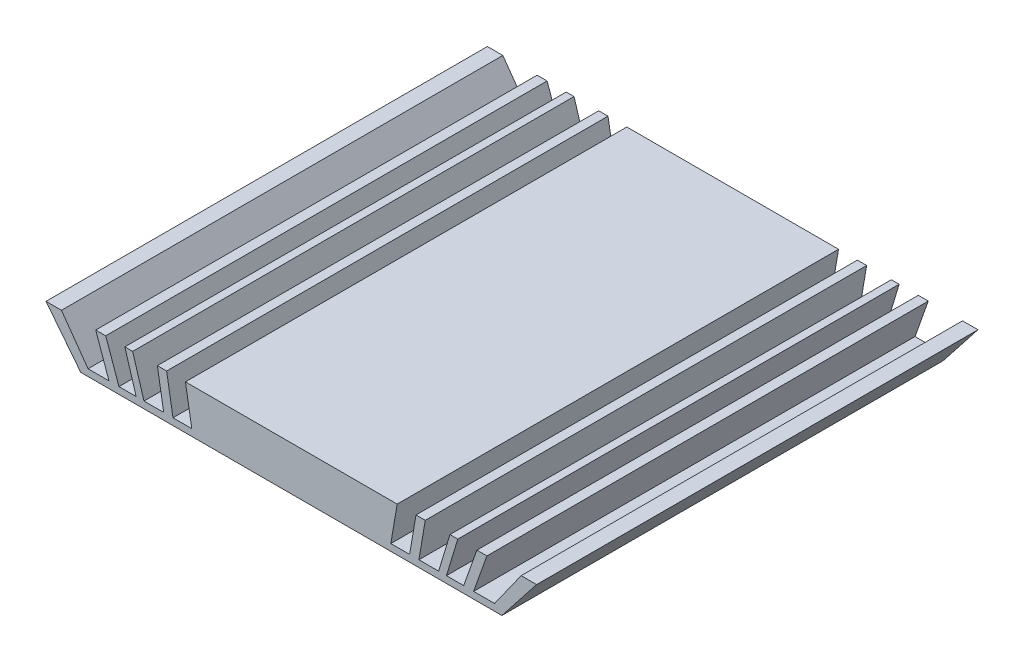
ISO-10303-21;
HEADER;
FILE_DESCRIPTION(('STEP AP214'),'2;1');
FILE_NAME('part.step','',(''),(''),'','','');
FILE_SCHEMA(('AUTOMOTIVE_DESIGN { 1 0 10303 214 1 1 1 1 }'));
ENDSEC;
DATA;
#1=APPLICATION_CONTEXT('core data for automotive mechanical design processes');
#2=APPLICATION_PROTOCOL_DEFINITION('international standard','automotive_design',2000,#1);
#3=PRODUCT_CONTEXT('',#1,'mechanical');
#4=PRODUCT('Part','Part','',(#3));
#5=PRODUCT_RELATED_PRODUCT_CATEGORY('part','',(#4));
#6=PRODUCT_DEFINITION_FORMATION('','',#4);
#7=PRODUCT_DEFINITION_CONTEXT('part definition',#1,'design');
#8=PRODUCT_DEFINITION('design','',#6,#7);
#9=PRODUCT_DEFINITION_SHAPE('','',#8);
#10=(LENGTH_UNIT() NAMED_UNIT(*) SI_UNIT(.MILLI.,.METRE.));
#11=(NAMED_UNIT(*) PLANE_ANGLE_UNIT() SI_UNIT($,.RADIAN.));
#12=(NAMED_UNIT(*) SI_UNIT($,.STERADIAN.) SOLID_ANGLE_UNIT());
#13=UNCERTAINTY_MEASURE_WITH_UNIT(LENGTH_MEASURE(1.E-05),#10,'distance_accuracy_value','');
#14=(GEOMETRIC_REPRESENTATION_CONTEXT(3) GLOBAL_UNCERTAINTY_ASSIGNED_CONTEXT((#13)) GLOBAL_UNIT_ASSIGNED_CONTEXT((#10,
#11,#12)) REPRESENTATION_CONTEXT('',''));
#15=CARTESIAN_POINT('',(0.,0.,0.));
#16=DIRECTION('',(0.,0.,1.));
#17=DIRECTION('',(1.,0.,0.));
#18=AXIS2_PLACEMENT_3D('',#15,#16,#17);
#19=CARTESIAN_POINT('',(0.,6.099999992,0.));
#20=DIRECTION('',(0.,1.,0.));
#21=DIRECTION('',(0.,0.,1.));
#22=AXIS2_PLACEMENT_3D('',#19,#20,#21);
#23=PLANE('',#22);
#24=DIRECTION('',(-1.,0.,0.));
#25=VECTOR('',#24,1.);
#26=CARTESIAN_POINT('',(-4.8,6.099999992,-61.));
#27=LINE('',#26,#25);
#28=CARTESIAN_POINT('',(63.,6.099999992,-61.));
#29=VERTEX_POINT('',#28);
#30=CARTESIAN_POINT('',(60.8616328443827,6.099999992,-61.));
#31=VERTEX_POINT('',#30);
#32=EDGE_CURVE('E142',#29,#31,#27,.T.);
#33=ORIENTED_EDGE('',*,*,#32,.T.);
#34=DIRECTION('',(0.,0.,1.));
#35=VECTOR('',#34,1.);
#36=CARTESIAN_POINT('',(60.8616328443827,6.099999992,-61.0011));
#37=LINE('',#36,#35);
#38=CARTESIAN_POINT('',(60.8616328443827,6.099999992,0.));
#39=VERTEX_POINT('',#38);
#40=EDGE_CURVE('E373',#31,#39,#37,.T.);
#41=ORIENTED_EDGE('',*,*,#40,.T.);
#42=DIRECTION('',(1.,0.,0.));
#43=VECTOR('',#42,1.);
#44=CARTESIAN_POINT('',(-4.8,6.099999992,0.));
#45=LINE('',#44,#43);
#46=CARTESIAN_POINT('',(63.,6.099999992,0.));
#47=VERTEX_POINT('',#46);
#48=EDGE_CURVE('E631',#39,#47,#45,.T.);
#49=ORIENTED_EDGE('',*,*,#48,.T.);
#50=DIRECTION('',(0.,0.,-1.));
#51=VECTOR('',#50,1.);
#52=CARTESIAN_POINT('',(63.,6.099999992,-61.));
#53=LINE('',#52,#51);
#54=EDGE_CURVE('E398',#47,#29,#53,.T.);
#55=ORIENTED_EDGE('',*,*,#54,.T.);
#56=EDGE_LOOP('',(#33,#41,#49,#55));
#57=FACE_BOUND('',#56,.T.);
#58=ADVANCED_FACE('F137',(#57),#23,.T.);
#59=CARTESIAN_POINT('',(0.,0.,0.));
#60=DIRECTION('',(0.,0.,1.));
#61=DIRECTION('',(1.,0.,0.));
#62=AXIS2_PLACEMENT_3D('',#59,#60,#61);
#63=PLANE('',#62);
#64=ORIENTED_EDGE('',*,*,#48,.F.);
#65=DIRECTION('',(-0.579547975187401,-0.814938123084313,0.));
#66=VECTOR('',#65,1.);
#67=CARTESIAN_POINT('',(37.5386758380275,-26.6958471531639,0.));
#68=LINE('',#67,#66);
#69=CARTESIAN_POINT('',(57.1893538487374,0.936182188675958,0.));
#70=VERTEX_POINT('',#69);
#71=EDGE_CURVE('E379',#39,#70,#68,.T.);
#72=ORIENTED_EDGE('',*,*,#71,.T.);
#73=DIRECTION('',(1.,0.,0.));
#74=VECTOR('',#73,1.);
#75=CARTESIAN_POINT('',(0.,0.936182188675939,0.));
#76=LINE('',#75,#74);
#77=CARTESIAN_POINT('',(54.2981834650608,0.936182188675957,0.));
#78=VERTEX_POINT('',#77);
#79=EDGE_CURVE('E384',#78,#70,#76,.T.);
#80=ORIENTED_EDGE('',*,*,#79,.F.);
#81=DIRECTION('',(-0.334669738772558,-0.94233548481945,0.));
#82=VECTOR('',#81,1.);
#83=CARTESIAN_POINT('',(47.9213338623366,-17.0192256831054,0.));
#84=LINE('',#83,#82);
#85=CARTESIAN_POINT('',(56.1321094745845,6.099999992,0.));
#86=VERTEX_POINT('',#85);
#87=EDGE_CURVE('E635',#86,#78,#84,.T.);
#88=ORIENTED_EDGE('',*,*,#87,.F.);
#89=CARTESIAN_POINT('',(54.7503843989159,6.099999992,0.));
#90=VERTEX_POINT('',#89);
#91=EDGE_CURVE('E579',#90,#86,#45,.T.);
#92=ORIENTED_EDGE('',*,*,#91,.F.);
#93=DIRECTION('',(-0.334669738772557,-0.942335484819451,0.));
#94=VECTOR('',#93,1.);
#95=CARTESIAN_POINT('',(46.6943672927461,-16.5834694286264,0.));
#96=LINE('',#95,#94);
#97=CARTESIAN_POINT('',(52.9164583893922,0.936182188675958,0.));
#98=VERTEX_POINT('',#97);
#99=EDGE_CURVE('E586',#90,#98,#96,.T.);
#100=ORIENTED_EDGE('',*,*,#99,.T.);
#101=DIRECTION('',(-1.,0.,0.));
#102=VECTOR('',#101,1.);
#103=CARTESIAN_POINT('',(0.,0.936182188675946,0.));
#104=LINE('',#103,#102);
#105=CARTESIAN_POINT('',(50.5416181557994,0.936182188675957,0.));
#106=VERTEX_POINT('',#105);
#107=EDGE_CURVE('E585',#98,#106,#104,.T.);
#108=ORIENTED_EDGE('',*,*,#107,.T.);
#109=DIRECTION('',(0.290155204687908,0.956979601241593,0.));
#110=VECTOR('',#109,1.);
#111=CARTESIAN_POINT('',(46.0265650059905,-13.9552059135511,0.));
#112=LINE('',#111,#110);
#113=CARTESIAN_POINT('',(52.1072822616494,6.099999992,0.));
#114=VERTEX_POINT('',#113);
#115=EDGE_CURVE('E582',#106,#114,#112,.T.);
#116=ORIENTED_EDGE('',*,*,#115,.T.);
#117=CARTESIAN_POINT('',(51.0259105183011,6.099999992,0.));
#118=VERTEX_POINT('',#117);
#119=EDGE_CURVE('E589',#118,#114,#45,.T.);
#120=ORIENTED_EDGE('',*,*,#119,.F.);
#121=DIRECTION('',(-0.290155204687908,-0.956979601241593,0.));
#122=VECTOR('',#121,1.);
#123=CARTESIAN_POINT('',(45.0362339960055,-13.6549385969457,0.));
#124=LINE('',#123,#122);
#125=CARTESIAN_POINT('',(49.4602464124512,0.936182188675957,0.));
#126=VERTEX_POINT('',#125);
#127=EDGE_CURVE('E774',#118,#126,#124,.T.);
#128=ORIENTED_EDGE('',*,*,#127,.T.);
#129=DIRECTION('',(1.,0.,0.));
#130=VECTOR('',#129,1.);
#131=CARTESIAN_POINT('',(0.,0.936182188675957,0.));
#132=LINE('',#131,#130);
#133=CARTESIAN_POINT('',(46.7359908682723,0.936182188675957,0.));
#134=VERTEX_POINT('',#133);
#135=EDGE_CURVE('E767',#134,#126,#132,.T.);
#136=ORIENTED_EDGE('',*,*,#135,.F.);
#137=DIRECTION('',(-0.167395618780172,-0.985889804599481,0.));
#138=VECTOR('',#137,1.);
#139=CARTESIAN_POINT('',(45.2718864171967,-7.68677737085536,0.));
#140=LINE('',#139,#138);
#141=CARTESIAN_POINT('',(47.6127627675482,6.099999992,0.));
#142=VERTEX_POINT('',#141);
#143=EDGE_CURVE('E765',#142,#134,#140,.T.);
#144=ORIENTED_EDGE('',*,*,#143,.F.);
#145=CARTESIAN_POINT('',(46.3289182007513,6.099999992,0.));
#146=VERTEX_POINT('',#145);
#147=EDGE_CURVE('E593',#146,#142,#45,.T.);
#148=ORIENTED_EDGE('',*,*,#147,.F.);
#149=DIRECTION('',(-0.167395618780172,-0.985889804599481,0.));
#150=VECTOR('',#149,1.);
#151=CARTESIAN_POINT('',(44.0240168354122,-7.47489983664693,0.));
#152=LINE('',#151,#150);
#153=CARTESIAN_POINT('',(45.4521463014753,0.936182188675958,0.));
#154=VERTEX_POINT('',#153);
#155=EDGE_CURVE('E812',#146,#154,#152,.T.);
#156=ORIENTED_EDGE('',*,*,#155,.T.);
#157=DIRECTION('',(-1.,0.,0.));
#158=VECTOR('',#157,1.);
#159=CARTESIAN_POINT('',(0.,0.936182188675955,0.));
#160=LINE('',#159,#158);
#161=CARTESIAN_POINT('',(42.8531438857644,0.936182188675957,0.));
#162=VERTEX_POINT('',#161);
#163=EDGE_CURVE('E809',#154,#162,#160,.T.);
#164=ORIENTED_EDGE('',*,*,#163,.T.);
#165=DIRECTION('',(0.167395618780171,0.985889804599482,0.));
#166=VECTOR('',#165,1.);
#167=CARTESIAN_POINT('',(41.4978418283852,-7.04597702349324,0.));
#168=LINE('',#167,#166);
#169=CARTESIAN_POINT('',(43.7299157850404,6.099999992,0.));
#170=VERTEX_POINT('',#169);
#171=EDGE_CURVE('E806',#162,#170,#168,.T.);
#172=ORIENTED_EDGE('',*,*,#171,.T.);
#173=CARTESIAN_POINT('',(14.4700842149596,6.099999992,0.));
#174=VERTEX_POINT('',#173);
#175=EDGE_CURVE('E622',#174,#170,#45,.T.);
#176=ORIENTED_EDGE('',*,*,#175,.F.);
#177=DIRECTION('',(-0.167395618780171,0.985889804599481,0.));
#178=VECTOR('',#177,1.);
#179=CARTESIAN_POINT('',(15.0713189081433,2.55898046890429,0.));
#180=LINE('',#179,#178);
#181=CARTESIAN_POINT('',(15.3468561142356,0.936182188675957,0.));
#182=VERTEX_POINT('',#181);
#183=EDGE_CURVE('E838',#182,#174,#180,.T.);
#184=ORIENTED_EDGE('',*,*,#183,.F.);
#185=DIRECTION('',(1.,0.,0.));
#186=VECTOR('',#185,1.);
#187=CARTESIAN_POINT('',(0.,0.936182188675958,0.));
#188=LINE('',#187,#186);
#189=CARTESIAN_POINT('',(12.7478536985247,0.936182188675957,0.));
#190=VERTEX_POINT('',#189);
#191=EDGE_CURVE('E833',#190,#182,#188,.T.);
#192=ORIENTED_EDGE('',*,*,#191,.F.);
#193=DIRECTION('',(0.167395618780171,-0.985889804599481,0.));
#194=VECTOR('',#193,1.);
#195=CARTESIAN_POINT('',(12.5451439011162,2.13005765575065,0.));
#196=LINE('',#195,#194);
#197=CARTESIAN_POINT('',(11.8710817992487,6.099999992,0.));
#198=VERTEX_POINT('',#197);
#199=EDGE_CURVE('E846',#198,#190,#196,.T.);
#200=ORIENTED_EDGE('',*,*,#199,.F.);
#201=CARTESIAN_POINT('',(10.5872372324518,6.099999992,0.));
#202=VERTEX_POINT('',#201);
#203=EDGE_CURVE('E617',#202,#198,#45,.T.);
#204=ORIENTED_EDGE('',*,*,#203,.F.);
#205=DIRECTION('',(0.167395618780172,-0.985889804599481,0.));
#206=VECTOR('',#205,1.);
#207=CARTESIAN_POINT('',(11.2972743193318,1.91818012154223,0.));
#208=LINE('',#207,#206);
#209=CARTESIAN_POINT('',(11.4640091317277,0.936182188675957,0.));
#210=VERTEX_POINT('',#209);
#211=EDGE_CURVE('E869',#202,#210,#208,.T.);
#212=ORIENTED_EDGE('',*,*,#211,.T.);
#213=DIRECTION('',(-1.,0.,0.));
#214=VECTOR('',#213,1.);
#215=CARTESIAN_POINT('',(0.,0.936182188675957,0.));
#216=LINE('',#215,#214);
#217=CARTESIAN_POINT('',(8.73975358754884,0.936182188675957,0.));
#218=VERTEX_POINT('',#217);
#219=EDGE_CURVE('E864',#210,#218,#216,.T.);
#220=ORIENTED_EDGE('',*,*,#219,.T.);
#221=DIRECTION('',(0.290155204687908,-0.956979601241593,0.));
#222=VECTOR('',#221,1.);
#223=CARTESIAN_POINT('',(8.26390551259907,2.50560742613402,0.));
#224=LINE('',#223,#222);
#225=CARTESIAN_POINT('',(7.1740894816989,6.099999992,0.));
#226=VERTEX_POINT('',#225);
#227=EDGE_CURVE('E877',#226,#218,#224,.T.);
#228=ORIENTED_EDGE('',*,*,#227,.F.);
#229=CARTESIAN_POINT('',(6.09271773835063,6.099999992,0.));
#230=VERTEX_POINT('',#229);
#231=EDGE_CURVE('E612',#230,#226,#45,.T.);
#232=ORIENTED_EDGE('',*,*,#231,.F.);
#233=DIRECTION('',(-0.290155204687908,0.956979601241593,0.));
#234=VECTOR('',#233,1.);
#235=CARTESIAN_POINT('',(7.27357450261409,2.20534010952856,0.));
#236=LINE('',#235,#234);
#237=CARTESIAN_POINT('',(7.65838184420057,0.936182188675957,0.));
#238=VERTEX_POINT('',#237);
#239=EDGE_CURVE('E707',#238,#230,#236,.T.);
#240=ORIENTED_EDGE('',*,*,#239,.F.);
#241=DIRECTION('',(1.,0.,0.));
#242=VECTOR('',#241,1.);
#243=CARTESIAN_POINT('',(0.,0.936182188675959,0.));
#244=LINE('',#243,#242);
#245=CARTESIAN_POINT('',(5.2835416106078,0.936182188675958,0.));
#246=VERTEX_POINT('',#245);
#247=EDGE_CURVE('E702',#246,#238,#244,.T.);
#248=ORIENTED_EDGE('',*,*,#247,.F.);
#249=DIRECTION('',(0.334669738772557,-0.94233548481945,0.));
#250=VECTOR('',#249,1.);
#251=CARTESIAN_POINT('',(4.98700956553856,1.77113269683865,0.));
#252=LINE('',#251,#250);
#253=CARTESIAN_POINT('',(3.44961560108407,6.099999992,0.));
#254=VERTEX_POINT('',#253);
#255=EDGE_CURVE('E704',#254,#246,#252,.T.);
#256=ORIENTED_EDGE('',*,*,#255,.F.);
#257=CARTESIAN_POINT('',(2.06789052541551,6.099999992,0.));
#258=VERTEX_POINT('',#257);
#259=EDGE_CURVE('E607',#258,#254,#45,.T.);
#260=ORIENTED_EDGE('',*,*,#259,.F.);
#261=DIRECTION('',(0.334669738772557,-0.94233548481945,0.));
#262=VECTOR('',#261,1.);
#263=CARTESIAN_POINT('',(3.76004299594803,1.33537644235971,0.));
#264=LINE('',#263,#262);
#265=CARTESIAN_POINT('',(3.90181653493924,0.936182188675957,0.));
#266=VERTEX_POINT('',#265);
#267=EDGE_CURVE('E669',#258,#266,#264,.T.);
#268=ORIENTED_EDGE('',*,*,#267,.T.);
#269=DIRECTION('',(-1.,0.,0.));
#270=VECTOR('',#269,1.);
#271=CARTESIAN_POINT('',(0.,0.936182188675958,0.));
#272=LINE('',#271,#270);
#273=CARTESIAN_POINT('',(1.01064615126257,0.936182188675958,0.));
#274=VERTEX_POINT('',#273);
#275=EDGE_CURVE('E666',#266,#274,#272,.T.);
#276=ORIENTED_EDGE('',*,*,#275,.T.);
#277=DIRECTION('',(0.579547975187401,-0.814938123084313,0.));
#278=VECTOR('',#277,1.);
#279=CARTESIAN_POINT('',(1.11334936932236,0.791764864582469,0.));
#280=LINE('',#279,#278);
#281=CARTESIAN_POINT('',(-2.6616328443827,6.099999992,0.));
#282=VERTEX_POINT('',#281);
#283=EDGE_CURVE('E664',#282,#274,#280,.T.);
#284=ORIENTED_EDGE('',*,*,#283,.F.);
#285=CARTESIAN_POINT('',(-4.8,6.099999992,0.));
#286=VERTEX_POINT('',#285);
#287=EDGE_CURVE('E532',#286,#282,#45,.T.);
#288=ORIENTED_EDGE('',*,*,#287,.F.);
#289=DIRECTION('',(-0.618390361845668,0.785871083814886,0.));
#290=VECTOR('',#289,1.);
#291=CARTESIAN_POINT('',(0.,0.,0.));
#292=LINE('',#291,#290);
#293=CARTESIAN_POINT('',(0.,0.,0.));
#294=VERTEX_POINT('',#293);
#295=EDGE_CURVE('E975',#294,#286,#292,.T.);
#296=ORIENTED_EDGE('',*,*,#295,.F.);
#297=DIRECTION('',(1.,0.,0.));
#298=VECTOR('',#297,1.);
#299=CARTESIAN_POINT('',(0.,0.,0.));
#300=LINE('',#299,#298);
#301=CARTESIAN_POINT('',(58.2,0.,0.));
#302=VERTEX_POINT('',#301);
#303=EDGE_CURVE('E12',#294,#302,#300,.T.);
#304=ORIENTED_EDGE('',*,*,#303,.T.);
#305=DIRECTION('',(0.618390361845668,0.785871083814886,0.));
#306=VECTOR('',#305,1.);
#307=CARTESIAN_POINT('',(58.2,0.,0.));
#308=LINE('',#307,#306);
#309=EDGE_CURVE('E1023',#302,#47,#308,.T.);
#310=ORIENTED_EDGE('',*,*,#309,.T.);
#311=EDGE_LOOP('',(#64,#72,#80,#88,#92,#100,#108,#116,#120,#128,#136,#144,#148,#156,#164,#172,
#176,#184,#192,#200,#204,#212,#220,#228,#232,#240,#248,#256,#260,#268,#276,#284,#288,#296,#304,#310));
#312=FACE_BOUND('',#311,.T.);
#313=ADVANCED_FACE('F477',(#312),#63,.T.);
#314=CARTESIAN_POINT('',(0.,0.,-61.));
#315=DIRECTION('',(0.,0.,-1.));
#316=DIRECTION('',(-1.,0.,0.));
#317=AXIS2_PLACEMENT_3D('',#314,#315,#316);
#318=PLANE('',#317);
#319=DIRECTION('',(1.,0.,0.));
#320=VECTOR('',#319,1.);
#321=CARTESIAN_POINT('',(0.,0.936182188675939,-61.));
#322=LINE('',#321,#320);
#323=CARTESIAN_POINT('',(54.2981834650608,0.936182188675964,-61.));
#324=VERTEX_POINT('',#323);
#325=CARTESIAN_POINT('',(57.1893538487374,0.936182188675958,-61.));
#326=VERTEX_POINT('',#325);
#327=EDGE_CURVE('E394',#324,#326,#322,.T.);
#328=ORIENTED_EDGE('',*,*,#327,.T.);
#329=DIRECTION('',(-0.579547975187401,-0.814938123084313,0.));
#330=VECTOR('',#329,1.);
#331=CARTESIAN_POINT('',(37.5386758380275,-26.6958471531639,-61.));
#332=LINE('',#331,#330);
#333=EDGE_CURVE('E376',#31,#326,#332,.T.);
#334=ORIENTED_EDGE('',*,*,#333,.F.);
#335=ORIENTED_EDGE('',*,*,#32,.F.);
#336=DIRECTION('',(0.618390361845668,0.785871083814886,0.));
#337=VECTOR('',#336,1.);
#338=CARTESIAN_POINT('',(58.2,0.,-61.));
#339=LINE('',#338,#337);
#340=CARTESIAN_POINT('',(58.2,0.,-61.));
#341=VERTEX_POINT('',#340);
#342=EDGE_CURVE('E495',#341,#29,#339,.T.);
#343=ORIENTED_EDGE('',*,*,#342,.F.);
#344=DIRECTION('',(-1.,0.,0.));
#345=VECTOR('',#344,1.);
#346=CARTESIAN_POINT('',(0.,0.,-61.));
#347=LINE('',#346,#345);
#348=CARTESIAN_POINT('',(0.,0.,-61.));
#349=VERTEX_POINT('',#348);
#350=EDGE_CURVE('E970',#341,#349,#347,.T.);
#351=ORIENTED_EDGE('',*,*,#350,.T.);
#352=DIRECTION('',(-0.618390361845668,0.785871083814886,0.));
#353=VECTOR('',#352,1.);
#354=CARTESIAN_POINT('',(0.,0.,-61.));
#355=LINE('',#354,#353);
#356=CARTESIAN_POINT('',(-4.8,6.099999992,-61.));
#357=VERTEX_POINT('',#356);
#358=EDGE_CURVE('E400',#349,#357,#355,.T.);
#359=ORIENTED_EDGE('',*,*,#358,.T.);
#360=CARTESIAN_POINT('',(-2.6616328443827,6.099999992,-61.));
#361=VERTEX_POINT('',#360);
#362=EDGE_CURVE('E715',#361,#357,#27,.T.);
#363=ORIENTED_EDGE('',*,*,#362,.F.);
#364=DIRECTION('',(0.579547975187401,-0.814938123084313,0.));
#365=VECTOR('',#364,1.);
#366=CARTESIAN_POINT('',(1.11334936932236,0.791764864582469,-61.));
#367=LINE('',#366,#365);
#368=CARTESIAN_POINT('',(1.01064615126257,0.936182188675958,-61.));
#369=VERTEX_POINT('',#368);
#370=EDGE_CURVE('E670',#361,#369,#367,.T.);
#371=ORIENTED_EDGE('',*,*,#370,.T.);
#372=DIRECTION('',(-1.,0.,0.));
#373=VECTOR('',#372,1.);
#374=CARTESIAN_POINT('',(0.,0.936182188675958,-61.));
#375=LINE('',#374,#373);
#376=CARTESIAN_POINT('',(3.90181653493924,0.936182188675957,-61.));
#377=VERTEX_POINT('',#376);
#378=EDGE_CURVE('E675',#377,#369,#375,.T.);
#379=ORIENTED_EDGE('',*,*,#378,.F.);
#380=DIRECTION('',(0.334669738772557,-0.94233548481945,0.));
#381=VECTOR('',#380,1.);
#382=CARTESIAN_POINT('',(3.76004299594803,1.33537644235971,-61.));
#383=LINE('',#382,#381);
#384=CARTESIAN_POINT('',(2.06789052541551,6.099999992,-61.));
#385=VERTEX_POINT('',#384);
#386=EDGE_CURVE('E639',#385,#377,#383,.T.);
#387=ORIENTED_EDGE('',*,*,#386,.F.);
#388=CARTESIAN_POINT('',(3.44961560108407,6.099999992,-61.));
#389=VERTEX_POINT('',#388);
#390=EDGE_CURVE('E712',#389,#385,#27,.T.);
#391=ORIENTED_EDGE('',*,*,#390,.F.);
#392=DIRECTION('',(0.334669738772557,-0.94233548481945,0.));
#393=VECTOR('',#392,1.);
#394=CARTESIAN_POINT('',(4.98700956553856,1.77113269683865,-61.));
#395=LINE('',#394,#393);
#396=CARTESIAN_POINT('',(5.2835416106078,0.936182188675958,-61.));
#397=VERTEX_POINT('',#396);
#398=EDGE_CURVE('E891',#389,#397,#395,.T.);
#399=ORIENTED_EDGE('',*,*,#398,.T.);
#400=DIRECTION('',(1.,0.,0.));
#401=VECTOR('',#400,1.);
#402=CARTESIAN_POINT('',(0.,0.936182188675959,-61.));
#403=LINE('',#402,#401);
#404=CARTESIAN_POINT('',(7.65838184420057,0.936182188675957,-61.));
#405=VERTEX_POINT('',#404);
#406=EDGE_CURVE('E886',#397,#405,#403,.T.);
#407=ORIENTED_EDGE('',*,*,#406,.T.);
#408=DIRECTION('',(-0.290155204687908,0.956979601241593,0.));
#409=VECTOR('',#408,1.);
#410=CARTESIAN_POINT('',(7.27357450261409,2.20534010952856,-61.));
#411=LINE('',#410,#409);
#412=CARTESIAN_POINT('',(6.09271773835062,6.099999992,-61.));
#413=VERTEX_POINT('',#412);
#414=EDGE_CURVE('E678',#405,#413,#411,.T.);
#415=ORIENTED_EDGE('',*,*,#414,.T.);
#416=CARTESIAN_POINT('',(7.1740894816989,6.099999992,-61.));
#417=VERTEX_POINT('',#416);
#418=EDGE_CURVE('E714',#417,#413,#27,.T.);
#419=ORIENTED_EDGE('',*,*,#418,.F.);
#420=DIRECTION('',(0.290155204687907,-0.956979601241593,0.));
#421=VECTOR('',#420,1.);
#422=CARTESIAN_POINT('',(8.26390551259907,2.50560742613402,-61.));
#423=LINE('',#422,#421);
#424=CARTESIAN_POINT('',(8.73975358754884,0.936182188675957,-61.));
#425=VERTEX_POINT('',#424);
#426=EDGE_CURVE('E861',#417,#425,#423,.T.);
#427=ORIENTED_EDGE('',*,*,#426,.T.);
#428=DIRECTION('',(-1.,0.,0.));
#429=VECTOR('',#428,1.);
#430=CARTESIAN_POINT('',(0.,0.936182188675957,-61.));
#431=LINE('',#430,#429);
#432=CARTESIAN_POINT('',(11.4640091317277,0.936182188675957,-61.));
#433=VERTEX_POINT('',#432);
#434=EDGE_CURVE('E855',#433,#425,#431,.T.);
#435=ORIENTED_EDGE('',*,*,#434,.F.);
#436=DIRECTION('',(0.167395618780172,-0.985889804599481,0.));
#437=VECTOR('',#436,1.);
#438=CARTESIAN_POINT('',(11.2972743193318,1.91818012154223,-61.));
#439=LINE('',#438,#437);
#440=CARTESIAN_POINT('',(10.5872372324518,6.099999992,-61.));
#441=VERTEX_POINT('',#440);
#442=EDGE_CURVE('E872',#441,#433,#439,.T.);
#443=ORIENTED_EDGE('',*,*,#442,.F.);
#444=CARTESIAN_POINT('',(11.8710817992487,6.099999992,-61.));
#445=VERTEX_POINT('',#444);
#446=EDGE_CURVE('E720',#445,#441,#27,.T.);
#447=ORIENTED_EDGE('',*,*,#446,.F.);
#448=DIRECTION('',(0.167395618780171,-0.985889804599481,0.));
#449=VECTOR('',#448,1.);
#450=CARTESIAN_POINT('',(12.5451439011162,2.13005765575065,-61.));
#451=LINE('',#450,#449);
#452=CARTESIAN_POINT('',(12.7478536985247,0.936182188675957,-61.));
#453=VERTEX_POINT('',#452);
#454=EDGE_CURVE('E830',#445,#453,#451,.T.);
#455=ORIENTED_EDGE('',*,*,#454,.T.);
#456=DIRECTION('',(1.,0.,0.));
#457=VECTOR('',#456,1.);
#458=CARTESIAN_POINT('',(0.,0.936182188675958,-61.));
#459=LINE('',#458,#457);
#460=CARTESIAN_POINT('',(15.3468561142356,0.936182188675957,-61.));
#461=VERTEX_POINT('',#460);
#462=EDGE_CURVE('E827',#453,#461,#459,.T.);
#463=ORIENTED_EDGE('',*,*,#462,.T.);
#464=DIRECTION('',(-0.167395618780171,0.985889804599481,0.));
#465=VECTOR('',#464,1.);
#466=CARTESIAN_POINT('',(15.0713189081433,2.55898046890429,-61.));
#467=LINE('',#466,#465);
#468=CARTESIAN_POINT('',(14.4700842149596,6.099999992,-61.));
#469=VERTEX_POINT('',#468);
#470=EDGE_CURVE('E841',#461,#469,#467,.T.);
#471=ORIENTED_EDGE('',*,*,#470,.T.);
#472=CARTESIAN_POINT('',(43.7299157850404,6.099999992,-61.));
#473=VERTEX_POINT('',#472);
#474=EDGE_CURVE('E763',#473,#469,#27,.T.);
#475=ORIENTED_EDGE('',*,*,#474,.F.);
#476=DIRECTION('',(0.167395618780171,0.985889804599482,0.));
#477=VECTOR('',#476,1.);
#478=CARTESIAN_POINT('',(41.4978418283852,-7.04597702349324,-61.));
#479=LINE('',#478,#477);
#480=CARTESIAN_POINT('',(42.8531438857644,0.936182188675957,-61.));
#481=VERTEX_POINT('',#480);
#482=EDGE_CURVE('E802',#481,#473,#479,.T.);
#483=ORIENTED_EDGE('',*,*,#482,.F.);
#484=DIRECTION('',(-1.,0.,0.));
#485=VECTOR('',#484,1.);
#486=CARTESIAN_POINT('',(0.,0.936182188675955,-61.));
#487=LINE('',#486,#485);
#488=CARTESIAN_POINT('',(45.4521463014753,0.936182188675957,-61.));
#489=VERTEX_POINT('',#488);
#490=EDGE_CURVE('E825',#489,#481,#487,.T.);
#491=ORIENTED_EDGE('',*,*,#490,.F.);
#492=DIRECTION('',(-0.167395618780172,-0.985889804599481,0.));
#493=VECTOR('',#492,1.);
#494=CARTESIAN_POINT('',(44.0240168354122,-7.47489983664693,-61.));
#495=LINE('',#494,#493);
#496=CARTESIAN_POINT('',(46.3289182007513,6.099999992,-61.));
#497=VERTEX_POINT('',#496);
#498=EDGE_CURVE('E758',#497,#489,#495,.T.);
#499=ORIENTED_EDGE('',*,*,#498,.F.);
#500=CARTESIAN_POINT('',(47.6127627675482,6.099999992,-61.));
#501=VERTEX_POINT('',#500);
#502=EDGE_CURVE('E581',#501,#497,#27,.T.);
#503=ORIENTED_EDGE('',*,*,#502,.F.);
#504=DIRECTION('',(-0.167395618780172,-0.985889804599481,0.));
#505=VECTOR('',#504,1.);
#506=CARTESIAN_POINT('',(45.2718864171967,-7.68677737085536,-61.));
#507=LINE('',#506,#505);
#508=CARTESIAN_POINT('',(46.7359908682723,0.936182188675956,-61.));
#509=VERTEX_POINT('',#508);
#510=EDGE_CURVE('E756',#501,#509,#507,.T.);
#511=ORIENTED_EDGE('',*,*,#510,.T.);
#512=DIRECTION('',(1.,0.,0.));
#513=VECTOR('',#512,1.);
#514=CARTESIAN_POINT('',(0.,0.936182188675957,-61.));
#515=LINE('',#514,#513);
#516=CARTESIAN_POINT('',(49.4602464124512,0.936182188675957,-61.));
#517=VERTEX_POINT('',#516);
#518=EDGE_CURVE('E776',#509,#517,#515,.T.);
#519=ORIENTED_EDGE('',*,*,#518,.T.);
#520=DIRECTION('',(-0.290155204687908,-0.956979601241593,0.));
#521=VECTOR('',#520,1.);
#522=CARTESIAN_POINT('',(45.0362339960055,-13.6549385969457,-61.));
#523=LINE('',#522,#521);
#524=CARTESIAN_POINT('',(51.0259105183011,6.099999992,-61.));
#525=VERTEX_POINT('',#524);
#526=EDGE_CURVE('E768',#525,#517,#523,.T.);
#527=ORIENTED_EDGE('',*,*,#526,.F.);
#528=CARTESIAN_POINT('',(52.1072822616494,6.099999992,-61.));
#529=VERTEX_POINT('',#528);
#530=EDGE_CURVE('E449',#529,#525,#27,.T.);
#531=ORIENTED_EDGE('',*,*,#530,.F.);
#532=DIRECTION('',(0.290155204687908,0.956979601241593,0.));
#533=VECTOR('',#532,1.);
#534=CARTESIAN_POINT('',(46.0265650059905,-13.9552059135511,-61.));
#535=LINE('',#534,#533);
#536=CARTESIAN_POINT('',(50.5416181557994,0.936182188675968,-61.));
#537=VERTEX_POINT('',#536);
#538=EDGE_CURVE('E1058',#537,#529,#535,.T.);
#539=ORIENTED_EDGE('',*,*,#538,.F.);
#540=DIRECTION('',(-1.,0.,0.));
#541=VECTOR('',#540,1.);
#542=CARTESIAN_POINT('',(0.,0.936182188675946,-61.));
#543=LINE('',#542,#541);
#544=CARTESIAN_POINT('',(52.9164583893922,0.936182188675958,-61.));
#545=VERTEX_POINT('',#544);
#546=EDGE_CURVE('E1066',#545,#537,#543,.T.);
#547=ORIENTED_EDGE('',*,*,#546,.F.);
#548=DIRECTION('',(-0.334669738772557,-0.942335484819451,0.));
#549=VECTOR('',#548,1.);
#550=CARTESIAN_POINT('',(46.6943672927461,-16.5834694286264,-61.));
#551=LINE('',#550,#549);
#552=CARTESIAN_POINT('',(54.7503843989159,6.099999992,-61.));
#553=VERTEX_POINT('',#552);
#554=EDGE_CURVE('E1070',#553,#545,#551,.T.);
#555=ORIENTED_EDGE('',*,*,#554,.F.);
#556=CARTESIAN_POINT('',(56.1321094745845,6.099999992,-61.));
#557=VERTEX_POINT('',#556);
#558=EDGE_CURVE('E401',#557,#553,#27,.T.);
#559=ORIENTED_EDGE('',*,*,#558,.F.);
#560=DIRECTION('',(-0.334669738772558,-0.94233548481945,0.));
#561=VECTOR('',#560,1.);
#562=CARTESIAN_POINT('',(47.9213338623366,-17.0192256831054,-61.));
#563=LINE('',#562,#561);
#564=EDGE_CURVE('E1096',#557,#324,#563,.T.);
#565=ORIENTED_EDGE('',*,*,#564,.T.);
#566=EDGE_LOOP('',(#328,#334,#335,#343,#351,#359,#363,#371,#379,#387,#391,#399,#407,#415,#419,
#427,#435,#443,#447,#455,#463,#471,#475,#483,#491,#499,#503,#511,#519,#527,#531,#539,#547,#555,
#559,#565));
#567=FACE_BOUND('',#566,.T.);
#568=ADVANCED_FACE('F389',(#567),#318,.T.);
#569=DIRECTION('',(0.,0.,1.));
#570=VECTOR('',#569,1.);
#571=CARTESIAN_POINT('',(56.1321094745845,6.099999992,-61.0011));
#572=LINE('',#571,#570);
#573=EDGE_CURVE('E383',#557,#86,#572,.T.);
#574=ORIENTED_EDGE('',*,*,#573,.F.);
#575=ORIENTED_EDGE('',*,*,#558,.T.);
#576=DIRECTION('',(0.,0.,1.));
#577=VECTOR('',#576,1.);
#578=CARTESIAN_POINT('',(54.7503843989159,6.099999992,-61.0011));
#579=LINE('',#578,#577);
#580=EDGE_CURVE('E1076',#553,#90,#579,.T.);
#581=ORIENTED_EDGE('',*,*,#580,.T.);
#582=ORIENTED_EDGE('',*,*,#91,.T.);
#583=EDGE_LOOP('',(#574,#575,#581,#582));
#584=FACE_BOUND('',#583,.T.);
#585=ADVANCED_FACE('F476',(#584),#23,.T.);
#586=ORIENTED_EDGE('',*,*,#119,.T.);
#587=DIRECTION('',(0.,0.,1.));
#588=VECTOR('',#587,1.);
#589=CARTESIAN_POINT('',(52.1072822616494,6.099999992,-61.0011));
#590=LINE('',#589,#588);
#591=EDGE_CURVE('E1079',#529,#114,#590,.T.);
#592=ORIENTED_EDGE('',*,*,#591,.F.);
#593=ORIENTED_EDGE('',*,*,#530,.T.);
#594=DIRECTION('',(0.,0.,1.));
#595=VECTOR('',#594,1.);
#596=CARTESIAN_POINT('',(51.0259105183011,6.099999992,-61.0011));
#597=LINE('',#596,#595);
#598=EDGE_CURVE('E788',#525,#118,#597,.T.);
#599=ORIENTED_EDGE('',*,*,#598,.T.);
#600=EDGE_LOOP('',(#586,#592,#593,#599));
#601=FACE_BOUND('',#600,.T.);
#602=ADVANCED_FACE('F961',(#601),#23,.T.);
#603=ORIENTED_EDGE('',*,*,#175,.T.);
#604=DIRECTION('',(0.,0.,1.));
#605=VECTOR('',#604,1.);
#606=CARTESIAN_POINT('',(43.7299157850404,6.099999992,-61.0011));
#607=LINE('',#606,#605);
#608=EDGE_CURVE('E824',#473,#170,#607,.T.);
#609=ORIENTED_EDGE('',*,*,#608,.F.);
#610=ORIENTED_EDGE('',*,*,#474,.T.);
#611=DIRECTION('',(0.,0.,1.));
#612=VECTOR('',#611,1.);
#613=CARTESIAN_POINT('',(14.4700842149596,6.099999992,-61.0011));
#614=LINE('',#613,#612);
#615=EDGE_CURVE('E845',#469,#174,#614,.T.);
#616=ORIENTED_EDGE('',*,*,#615,.T.);
#617=EDGE_LOOP('',(#603,#609,#610,#616));
#618=FACE_BOUND('',#617,.T.);
#619=ADVANCED_FACE('F931',(#618),#23,.T.);
#620=DIRECTION('',(0.,0.,1.));
#621=VECTOR('',#620,1.);
#622=CARTESIAN_POINT('',(47.6127627675482,6.099999992,-61.0011));
#623=LINE('',#622,#621);
#624=EDGE_CURVE('E791',#501,#142,#623,.T.);
#625=ORIENTED_EDGE('',*,*,#624,.F.);
#626=ORIENTED_EDGE('',*,*,#502,.T.);
#627=DIRECTION('',(0.,0.,1.));
#628=VECTOR('',#627,1.);
#629=CARTESIAN_POINT('',(46.3289182007513,6.099999992,-61.0011));
#630=LINE('',#629,#628);
#631=EDGE_CURVE('E815',#497,#146,#630,.T.);
#632=ORIENTED_EDGE('',*,*,#631,.T.);
#633=ORIENTED_EDGE('',*,*,#147,.T.);
#634=EDGE_LOOP('',(#625,#626,#632,#633));
#635=FACE_BOUND('',#634,.T.);
#636=ADVANCED_FACE('F936',(#635),#23,.T.);
#637=DIRECTION('',(0.,0.,1.));
#638=VECTOR('',#637,1.);
#639=CARTESIAN_POINT('',(11.8710817992487,6.099999992,-61.0011));
#640=LINE('',#639,#638);
#641=EDGE_CURVE('E842',#445,#198,#640,.T.);
#642=ORIENTED_EDGE('',*,*,#641,.F.);
#643=ORIENTED_EDGE('',*,*,#446,.T.);
#644=DIRECTION('',(0.,0.,1.));
#645=VECTOR('',#644,1.);
#646=CARTESIAN_POINT('',(10.5872372324518,6.099999992,-61.0011));
#647=LINE('',#646,#645);
#648=EDGE_CURVE('E876',#441,#202,#647,.T.);
#649=ORIENTED_EDGE('',*,*,#648,.T.);
#650=ORIENTED_EDGE('',*,*,#203,.T.);
#651=EDGE_LOOP('',(#642,#643,#649,#650));
#652=FACE_BOUND('',#651,.T.);
#653=ADVANCED_FACE('F1333',(#652),#23,.T.);
#654=DIRECTION('',(0.,0.,1.));
#655=VECTOR('',#654,1.);
#656=CARTESIAN_POINT('',(3.44961560108407,6.099999992,-61.0011));
#657=LINE('',#656,#655);
#658=EDGE_CURVE('E679',#389,#254,#657,.T.);
#659=ORIENTED_EDGE('',*,*,#658,.F.);
#660=ORIENTED_EDGE('',*,*,#390,.T.);
#661=DIRECTION('',(0.,0.,1.));
#662=VECTOR('',#661,1.);
#663=CARTESIAN_POINT('',(2.06789052541551,6.099999992,-61.0011));
#664=LINE('',#663,#662);
#665=EDGE_CURVE('E653',#385,#258,#664,.T.);
#666=ORIENTED_EDGE('',*,*,#665,.T.);
#667=ORIENTED_EDGE('',*,*,#259,.T.);
#668=EDGE_LOOP('',(#659,#660,#666,#667));
#669=FACE_BOUND('',#668,.T.);
#670=ADVANCED_FACE('F732',(#669),#23,.T.);
#671=DIRECTION('',(0.,0.,1.));
#672=VECTOR('',#671,1.);
#673=CARTESIAN_POINT('',(7.1740894816989,6.099999992,-61.0011));
#674=LINE('',#673,#672);
#675=EDGE_CURVE('E873',#417,#226,#674,.T.);
#676=ORIENTED_EDGE('',*,*,#675,.F.);
#677=ORIENTED_EDGE('',*,*,#418,.T.);
#678=DIRECTION('',(0.,0.,1.));
#679=VECTOR('',#678,1.);
#680=CARTESIAN_POINT('',(6.09271773835063,6.099999992,-61.0011));
#681=LINE('',#680,#679);
#682=EDGE_CURVE('E683',#413,#230,#681,.T.);
#683=ORIENTED_EDGE('',*,*,#682,.T.);
#684=ORIENTED_EDGE('',*,*,#231,.T.);
#685=EDGE_LOOP('',(#676,#677,#683,#684));
#686=FACE_BOUND('',#685,.T.);
#687=ADVANCED_FACE('F901',(#686),#23,.T.);
#688=DIRECTION('',(0.,0.,1.));
#689=VECTOR('',#688,1.);
#690=CARTESIAN_POINT('',(-2.6616328443827,6.099999992,-61.0011));
#691=LINE('',#690,#689);
#692=EDGE_CURVE('E649',#361,#282,#691,.T.);
#693=ORIENTED_EDGE('',*,*,#692,.F.);
#694=ORIENTED_EDGE('',*,*,#362,.T.);
#695=DIRECTION('',(0.,0.,1.));
#696=VECTOR('',#695,1.);
#697=CARTESIAN_POINT('',(-4.8,6.099999992,-61.));
#698=LINE('',#697,#696);
#699=EDGE_CURVE('E408',#357,#286,#698,.T.);
#700=ORIENTED_EDGE('',*,*,#699,.T.);
#701=ORIENTED_EDGE('',*,*,#287,.T.);
#702=EDGE_LOOP('',(#693,#694,#700,#701));
#703=FACE_BOUND('',#702,.T.);
#704=ADVANCED_FACE('F139',(#703),#23,.T.);
#705=CARTESIAN_POINT('',(0.,0.,0.));
#706=DIRECTION('',(0.,-1.,0.));
#707=DIRECTION('',(0.,0.,-1.));
#708=AXIS2_PLACEMENT_3D('',#705,#706,#707);
#709=PLANE('',#708);
#710=DIRECTION('',(0.,0.,1.));
#711=VECTOR('',#710,1.);
#712=CARTESIAN_POINT('',(0.,0.,0.));
#713=LINE('',#712,#711);
#714=EDGE_CURVE('E503',#349,#294,#713,.T.);
#715=ORIENTED_EDGE('',*,*,#714,.F.);
#716=ORIENTED_EDGE('',*,*,#350,.F.);
#717=DIRECTION('',(0.,0.,-1.));
#718=VECTOR('',#717,1.);
#719=CARTESIAN_POINT('',(58.2,0.,0.));
#720=LINE('',#719,#718);
#721=EDGE_CURVE('E148',#302,#341,#720,.T.);
#722=ORIENTED_EDGE('',*,*,#721,.F.);
#723=ORIENTED_EDGE('',*,*,#303,.F.);
#724=EDGE_LOOP('',(#715,#716,#722,#723));
#725=FACE_BOUND('',#724,.T.);
#726=ADVANCED_FACE('F516',(#725),#709,.T.);
#727=CARTESIAN_POINT('',(0.,0.,0.));
#728=DIRECTION('',(0.785871083814886,0.618390361845668,0.));
#729=DIRECTION('',(-0.618390361845668,0.785871083814886,0.));
#730=AXIS2_PLACEMENT_3D('',#727,#728,#729);
#731=PLANE('',#730);
#732=ORIENTED_EDGE('',*,*,#295,.T.);
#733=ORIENTED_EDGE('',*,*,#699,.F.);
#734=ORIENTED_EDGE('',*,*,#358,.F.);
#735=ORIENTED_EDGE('',*,*,#714,.T.);
#736=EDGE_LOOP('',(#732,#733,#734,#735));
#737=FACE_BOUND('',#736,.T.);
#738=ADVANCED_FACE('F507',(#737),#731,.F.);
#739=CARTESIAN_POINT('',(35.9439335739056,-28.2837510460683,0.));
#740=DIRECTION('',(-0.785871083814886,0.618390361845668,0.));
#741=DIRECTION('',(-0.618390361845668,-0.785871083814886,0.));
#742=AXIS2_PLACEMENT_3D('',#739,#740,#741);
#743=PLANE('',#742);
#744=ORIENTED_EDGE('',*,*,#342,.T.);
#745=ORIENTED_EDGE('',*,*,#54,.F.);
#746=ORIENTED_EDGE('',*,*,#309,.F.);
#747=ORIENTED_EDGE('',*,*,#721,.T.);
#748=EDGE_LOOP('',(#744,#745,#746,#747));
#749=FACE_BOUND('',#748,.T.);
#750=ADVANCED_FACE('F478',(#749),#743,.F.);
#751=CARTESIAN_POINT('',(0.,0.936182188675958,-61.0011));
#752=DIRECTION('',(0.,1.,0.));
#753=DIRECTION('',(-1.,0.,0.));
#754=AXIS2_PLACEMENT_3D('',#751,#752,#753);
#755=PLANE('',#754);
#756=ORIENTED_EDGE('',*,*,#378,.T.);
#757=DIRECTION('',(0.,0.,1.));
#758=VECTOR('',#757,1.);
#759=CARTESIAN_POINT('',(1.01064615126257,0.936182188675958,-61.0011));
#760=LINE('',#759,#758);
#761=EDGE_CURVE('E643',#369,#274,#760,.T.);
#762=ORIENTED_EDGE('',*,*,#761,.T.);
#763=ORIENTED_EDGE('',*,*,#275,.F.);
#764=DIRECTION('',(0.,0.,1.));
#765=VECTOR('',#764,1.);
#766=CARTESIAN_POINT('',(3.90181653493924,0.936182188675957,-61.0011));
#767=LINE('',#766,#765);
#768=EDGE_CURVE('E663',#377,#266,#767,.T.);
#769=ORIENTED_EDGE('',*,*,#768,.F.);
#770=EDGE_LOOP('',(#756,#762,#763,#769));
#771=FACE_BOUND('',#770,.T.);
#772=ADVANCED_FACE('F991',(#771),#755,.T.);
#773=CARTESIAN_POINT('',(1.11334936932236,0.791764864582469,-61.0011));
#774=DIRECTION('',(-0.814938123084314,-0.579547975187401,0.));
#775=DIRECTION('',(0.579547975187401,-0.814938123084313,0.));
#776=AXIS2_PLACEMENT_3D('',#773,#774,#775);
#777=PLANE('',#776);
#778=ORIENTED_EDGE('',*,*,#692,.T.);
#779=ORIENTED_EDGE('',*,*,#283,.T.);
#780=ORIENTED_EDGE('',*,*,#761,.F.);
#781=ORIENTED_EDGE('',*,*,#370,.F.);
#782=EDGE_LOOP('',(#778,#779,#780,#781));
#783=FACE_BOUND('',#782,.T.);
#784=ADVANCED_FACE('F1155',(#783),#777,.F.);
#785=CARTESIAN_POINT('',(3.76004299594803,1.33537644235971,-61.0011));
#786=DIRECTION('',(-0.94233548481945,-0.334669738772557,0.));
#787=DIRECTION('',(0.334669738772557,-0.94233548481945,0.));
#788=AXIS2_PLACEMENT_3D('',#785,#786,#787);
#789=PLANE('',#788);
#790=ORIENTED_EDGE('',*,*,#386,.T.);
#791=ORIENTED_EDGE('',*,*,#768,.T.);
#792=ORIENTED_EDGE('',*,*,#267,.F.);
#793=ORIENTED_EDGE('',*,*,#665,.F.);
#794=EDGE_LOOP('',(#790,#791,#792,#793));
#795=FACE_BOUND('',#794,.T.);
#796=ADVANCED_FACE('F731',(#795),#789,.T.);
#797=CARTESIAN_POINT('',(0.,0.936182188675959,-61.0011));
#798=DIRECTION('',(0.,-1.,0.));
#799=DIRECTION('',(1.,0.,0.));
#800=AXIS2_PLACEMENT_3D('',#797,#798,#799);
#801=PLANE('',#800);
#802=DIRECTION('',(0.,0.,1.));
#803=VECTOR('',#802,1.);
#804=CARTESIAN_POINT('',(5.2835416106078,0.936182188675958,-61.0011));
#805=LINE('',#804,#803);
#806=EDGE_CURVE('E682',#397,#246,#805,.T.);
#807=ORIENTED_EDGE('',*,*,#806,.T.);
#808=ORIENTED_EDGE('',*,*,#247,.T.);
#809=DIRECTION('',(0.,0.,1.));
#810=VECTOR('',#809,1.);
#811=CARTESIAN_POINT('',(7.65838184420057,0.936182188675957,-61.0011));
#812=LINE('',#811,#810);
#813=EDGE_CURVE('E692',#405,#238,#812,.T.);
#814=ORIENTED_EDGE('',*,*,#813,.F.);
#815=ORIENTED_EDGE('',*,*,#406,.F.);
#816=EDGE_LOOP('',(#807,#808,#814,#815));
#817=FACE_BOUND('',#816,.T.);
#818=ADVANCED_FACE('F895',(#817),#801,.F.);
#819=CARTESIAN_POINT('',(4.98700956553856,1.77113269683865,-61.0011));
#820=DIRECTION('',(-0.94233548481945,-0.334669738772557,0.));
#821=DIRECTION('',(0.334669738772557,-0.94233548481945,0.));
#822=AXIS2_PLACEMENT_3D('',#819,#820,#821);
#823=PLANE('',#822);
#824=ORIENTED_EDGE('',*,*,#658,.T.);
#825=ORIENTED_EDGE('',*,*,#255,.T.);
#826=ORIENTED_EDGE('',*,*,#806,.F.);
#827=ORIENTED_EDGE('',*,*,#398,.F.);
#828=EDGE_LOOP('',(#824,#825,#826,#827));
#829=FACE_BOUND('',#828,.T.);
#830=ADVANCED_FACE('F1148',(#829),#823,.F.);
#831=CARTESIAN_POINT('',(7.27357450261409,2.20534010952856,-61.0011));
#832=DIRECTION('',(0.956979601241593,0.290155204687908,0.));
#833=DIRECTION('',(-0.290155204687908,0.956979601241593,0.));
#834=AXIS2_PLACEMENT_3D('',#831,#832,#833);
#835=PLANE('',#834);
#836=ORIENTED_EDGE('',*,*,#813,.T.);
#837=ORIENTED_EDGE('',*,*,#239,.T.);
#838=ORIENTED_EDGE('',*,*,#682,.F.);
#839=ORIENTED_EDGE('',*,*,#414,.F.);
#840=EDGE_LOOP('',(#836,#837,#838,#839));
#841=FACE_BOUND('',#840,.T.);
#842=ADVANCED_FACE('F898',(#841),#835,.F.);
#843=CARTESIAN_POINT('',(0.,0.936182188675957,-61.0011));
#844=DIRECTION('',(0.,1.,0.));
#845=DIRECTION('',(0.,0.,1.));
#846=AXIS2_PLACEMENT_3D('',#843,#844,#845);
#847=PLANE('',#846);
#848=ORIENTED_EDGE('',*,*,#434,.T.);
#849=DIRECTION('',(0.,0.,1.));
#850=VECTOR('',#849,1.);
#851=CARTESIAN_POINT('',(8.73975358754884,0.936182188675957,-61.0011));
#852=LINE('',#851,#850);
#853=EDGE_CURVE('E870',#425,#218,#852,.T.);
#854=ORIENTED_EDGE('',*,*,#853,.T.);
#855=ORIENTED_EDGE('',*,*,#219,.F.);
#856=DIRECTION('',(0.,0.,1.));
#857=VECTOR('',#856,1.);
#858=CARTESIAN_POINT('',(11.4640091317277,0.936182188675957,-61.0011));
#859=LINE('',#858,#857);
#860=EDGE_CURVE('E874',#433,#210,#859,.T.);
#861=ORIENTED_EDGE('',*,*,#860,.F.);
#862=EDGE_LOOP('',(#848,#854,#855,#861));
#863=FACE_BOUND('',#862,.T.);
#864=ADVANCED_FACE('F909',(#863),#847,.T.);
#865=CARTESIAN_POINT('',(8.26390551259907,2.50560742613402,-61.0011));
#866=DIRECTION('',(-0.956979601241593,-0.290155204687908,0.));
#867=DIRECTION('',(0.290155204687908,-0.956979601241593,0.));
#868=AXIS2_PLACEMENT_3D('',#865,#866,#867);
#869=PLANE('',#868);
#870=ORIENTED_EDGE('',*,*,#675,.T.);
#871=ORIENTED_EDGE('',*,*,#227,.T.);
#872=ORIENTED_EDGE('',*,*,#853,.F.);
#873=ORIENTED_EDGE('',*,*,#426,.F.);
#874=EDGE_LOOP('',(#870,#871,#872,#873));
#875=FACE_BOUND('',#874,.T.);
#876=ADVANCED_FACE('F905',(#875),#869,.F.);
#877=CARTESIAN_POINT('',(11.2972743193318,1.91818012154223,-61.0011));
#878=DIRECTION('',(-0.985889804599481,-0.167395618780172,0.));
#879=DIRECTION('',(0.167395618780172,-0.985889804599481,0.));
#880=AXIS2_PLACEMENT_3D('',#877,#878,#879);
#881=PLANE('',#880);
#882=ORIENTED_EDGE('',*,*,#442,.T.);
#883=ORIENTED_EDGE('',*,*,#860,.T.);
#884=ORIENTED_EDGE('',*,*,#211,.F.);
#885=ORIENTED_EDGE('',*,*,#648,.F.);
#886=EDGE_LOOP('',(#882,#883,#884,#885));
#887=FACE_BOUND('',#886,.T.);
#888=ADVANCED_FACE('F913',(#887),#881,.T.);
#889=CARTESIAN_POINT('',(0.,0.936182188675958,-61.0011));
#890=DIRECTION('',(0.,-1.,0.));
#891=DIRECTION('',(1.,0.,0.));
#892=AXIS2_PLACEMENT_3D('',#889,#890,#891);
#893=PLANE('',#892);
#894=DIRECTION('',(0.,0.,1.));
#895=VECTOR('',#894,1.);
#896=CARTESIAN_POINT('',(12.7478536985247,0.936182188675957,-61.0011));
#897=LINE('',#896,#895);
#898=EDGE_CURVE('E839',#453,#190,#897,.T.);
#899=ORIENTED_EDGE('',*,*,#898,.T.);
#900=ORIENTED_EDGE('',*,*,#191,.T.);
#901=DIRECTION('',(0.,0.,1.));
#902=VECTOR('',#901,1.);
#903=CARTESIAN_POINT('',(15.3468561142356,0.936182188675957,-61.0011));
#904=LINE('',#903,#902);
#905=EDGE_CURVE('E843',#461,#182,#904,.T.);
#906=ORIENTED_EDGE('',*,*,#905,.F.);
#907=ORIENTED_EDGE('',*,*,#462,.F.);
#908=EDGE_LOOP('',(#899,#900,#906,#907));
#909=FACE_BOUND('',#908,.T.);
#910=ADVANCED_FACE('F1136',(#909),#893,.F.);
#911=CARTESIAN_POINT('',(12.5451439011162,2.13005765575065,-61.0011));
#912=DIRECTION('',(-0.985889804599482,-0.167395618780171,0.));
#913=DIRECTION('',(0.167395618780171,-0.985889804599481,0.));
#914=AXIS2_PLACEMENT_3D('',#911,#912,#913);
#915=PLANE('',#914);
#916=ORIENTED_EDGE('',*,*,#641,.T.);
#917=ORIENTED_EDGE('',*,*,#199,.T.);
#918=ORIENTED_EDGE('',*,*,#898,.F.);
#919=ORIENTED_EDGE('',*,*,#454,.F.);
#920=EDGE_LOOP('',(#916,#917,#918,#919));
#921=FACE_BOUND('',#920,.T.);
#922=ADVANCED_FACE('F1133',(#921),#915,.F.);
#923=CARTESIAN_POINT('',(15.0713189081433,2.55898046890429,-61.0011));
#924=DIRECTION('',(0.985889804599482,0.167395618780171,0.));
#925=DIRECTION('',(-0.167395618780171,0.985889804599481,0.));
#926=AXIS2_PLACEMENT_3D('',#923,#924,#925);
#927=PLANE('',#926);
#928=ORIENTED_EDGE('',*,*,#905,.T.);
#929=ORIENTED_EDGE('',*,*,#183,.T.);
#930=ORIENTED_EDGE('',*,*,#615,.F.);
#931=ORIENTED_EDGE('',*,*,#470,.F.);
#932=EDGE_LOOP('',(#928,#929,#930,#931));
#933=FACE_BOUND('',#932,.T.);
#934=ADVANCED_FACE('F928',(#933),#927,.F.);
#935=CARTESIAN_POINT('',(41.4978418283852,-7.04597702349324,-61.0011));
#936=DIRECTION('',(0.985889804599482,-0.167395618780171,0.));
#937=DIRECTION('',(0.167395618780171,0.985889804599482,0.));
#938=AXIS2_PLACEMENT_3D('',#935,#936,#937);
#939=PLANE('',#938);
#940=ORIENTED_EDGE('',*,*,#482,.T.);
#941=ORIENTED_EDGE('',*,*,#608,.T.);
#942=ORIENTED_EDGE('',*,*,#171,.F.);
#943=DIRECTION('',(0.,0.,1.));
#944=VECTOR('',#943,1.);
#945=CARTESIAN_POINT('',(42.8531438857644,0.936182188675957,-61.0011));
#946=LINE('',#945,#944);
#947=EDGE_CURVE('E816',#481,#162,#946,.T.);
#948=ORIENTED_EDGE('',*,*,#947,.F.);
#949=EDGE_LOOP('',(#940,#941,#942,#948));
#950=FACE_BOUND('',#949,.T.);
#951=ADVANCED_FACE('F1126',(#950),#939,.T.);
#952=CARTESIAN_POINT('',(44.0240168354122,-7.47489983664693,-61.0011));
#953=DIRECTION('',(-0.985889804599481,0.167395618780172,0.));
#954=DIRECTION('',(-0.167395618780172,-0.985889804599481,0.));
#955=AXIS2_PLACEMENT_3D('',#952,#953,#954);
#956=PLANE('',#955);
#957=ORIENTED_EDGE('',*,*,#498,.T.);
#958=DIRECTION('',(0.,0.,1.));
#959=VECTOR('',#958,1.);
#960=CARTESIAN_POINT('',(45.4521463014753,0.936182188675958,-61.0011));
#961=LINE('',#960,#959);
#962=EDGE_CURVE('E813',#489,#154,#961,.T.);
#963=ORIENTED_EDGE('',*,*,#962,.T.);
#964=ORIENTED_EDGE('',*,*,#155,.F.);
#965=ORIENTED_EDGE('',*,*,#631,.F.);
#966=EDGE_LOOP('',(#957,#963,#964,#965));
#967=FACE_BOUND('',#966,.T.);
#968=ADVANCED_FACE('F1120',(#967),#956,.T.);
#969=CARTESIAN_POINT('',(0.,0.936182188675955,-61.0011));
#970=DIRECTION('',(0.,1.,0.));
#971=DIRECTION('',(-1.,0.,0.));
#972=AXIS2_PLACEMENT_3D('',#969,#970,#971);
#973=PLANE('',#972);
#974=ORIENTED_EDGE('',*,*,#490,.T.);
#975=ORIENTED_EDGE('',*,*,#947,.T.);
#976=ORIENTED_EDGE('',*,*,#163,.F.);
#977=ORIENTED_EDGE('',*,*,#962,.F.);
#978=EDGE_LOOP('',(#974,#975,#976,#977));
#979=FACE_BOUND('',#978,.T.);
#980=ADVANCED_FACE('F1116',(#979),#973,.T.);
#981=CARTESIAN_POINT('',(45.0362339960055,-13.6549385969457,-61.0011));
#982=DIRECTION('',(-0.956979601241593,0.290155204687908,0.));
#983=DIRECTION('',(-0.290155204687908,-0.956979601241593,0.));
#984=AXIS2_PLACEMENT_3D('',#981,#982,#983);
#985=PLANE('',#984);
#986=ORIENTED_EDGE('',*,*,#526,.T.);
#987=DIRECTION('',(0.,0.,1.));
#988=VECTOR('',#987,1.);
#989=CARTESIAN_POINT('',(49.4602464124512,0.936182188675957,-61.0011));
#990=LINE('',#989,#988);
#991=EDGE_CURVE('E786',#517,#126,#990,.T.);
#992=ORIENTED_EDGE('',*,*,#991,.T.);
#993=ORIENTED_EDGE('',*,*,#127,.F.);
#994=ORIENTED_EDGE('',*,*,#598,.F.);
#995=EDGE_LOOP('',(#986,#992,#993,#994));
#996=FACE_BOUND('',#995,.T.);
#997=ADVANCED_FACE('F953',(#996),#985,.T.);
#998=CARTESIAN_POINT('',(0.,0.936182188675957,-61.0011));
#999=DIRECTION('',(0.,-1.,0.));
#1000=DIRECTION('',(0.,0.,-1.));
#1001=AXIS2_PLACEMENT_3D('',#998,#999,#1000);
#1002=PLANE('',#1001);
#1003=DIRECTION('',(0.,0.,1.));
#1004=VECTOR('',#1003,1.);
#1005=CARTESIAN_POINT('',(46.7359908682723,0.936182188675957,-61.0011));
#1006=LINE('',#1005,#1004);
#1007=EDGE_CURVE('E789',#509,#134,#1006,.T.);
#1008=ORIENTED_EDGE('',*,*,#1007,.T.);
#1009=ORIENTED_EDGE('',*,*,#135,.T.);
#1010=ORIENTED_EDGE('',*,*,#991,.F.);
#1011=ORIENTED_EDGE('',*,*,#518,.F.);
#1012=EDGE_LOOP('',(#1008,#1009,#1010,#1011));
#1013=FACE_BOUND('',#1012,.T.);
#1014=ADVANCED_FACE('F940',(#1013),#1002,.F.);
#1015=CARTESIAN_POINT('',(45.2718864171967,-7.68677737085536,-61.0011));
#1016=DIRECTION('',(-0.985889804599481,0.167395618780172,0.));
#1017=DIRECTION('',(-0.167395618780172,-0.985889804599481,0.));
#1018=AXIS2_PLACEMENT_3D('',#1015,#1016,#1017);
#1019=PLANE('',#1018);
#1020=ORIENTED_EDGE('',*,*,#624,.T.);
#1021=ORIENTED_EDGE('',*,*,#143,.T.);
#1022=ORIENTED_EDGE('',*,*,#1007,.F.);
#1023=ORIENTED_EDGE('',*,*,#510,.F.);
#1024=EDGE_LOOP('',(#1020,#1021,#1022,#1023));
#1025=FACE_BOUND('',#1024,.T.);
#1026=ADVANCED_FACE('F942',(#1025),#1019,.F.);
#1027=CARTESIAN_POINT('',(46.6943672927461,-16.5834694286264,-61.0011));
#1028=DIRECTION('',(-0.94233548481945,0.334669738772557,0.));
#1029=DIRECTION('',(-0.334669738772557,-0.94233548481945,0.));
#1030=AXIS2_PLACEMENT_3D('',#1027,#1028,#1029);
#1031=PLANE('',#1030);
#1032=ORIENTED_EDGE('',*,*,#554,.T.);
#1033=DIRECTION('',(0.,0.,1.));
#1034=VECTOR('',#1033,1.);
#1035=CARTESIAN_POINT('',(52.9164583893922,0.936182188675958,-61.0011));
#1036=LINE('',#1035,#1034);
#1037=EDGE_CURVE('E780',#545,#98,#1036,.T.);
#1038=ORIENTED_EDGE('',*,*,#1037,.T.);
#1039=ORIENTED_EDGE('',*,*,#99,.F.);
#1040=ORIENTED_EDGE('',*,*,#580,.F.);
#1041=EDGE_LOOP('',(#1032,#1038,#1039,#1040));
#1042=FACE_BOUND('',#1041,.T.);
#1043=ADVANCED_FACE('F944',(#1042),#1031,.T.);
#1044=CARTESIAN_POINT('',(0.,0.936182188675946,-61.0011));
#1045=DIRECTION('',(0.,1.,0.));
#1046=DIRECTION('',(-1.,0.,0.));
#1047=AXIS2_PLACEMENT_3D('',#1044,#1045,#1046);
#1048=PLANE('',#1047);
#1049=ORIENTED_EDGE('',*,*,#546,.T.);
#1050=DIRECTION('',(0.,0.,1.));
#1051=VECTOR('',#1050,1.);
#1052=CARTESIAN_POINT('',(50.5416181557994,0.936182188675957,-61.0011));
#1053=LINE('',#1052,#1051);
#1054=EDGE_CURVE('E164',#537,#106,#1053,.T.);
#1055=ORIENTED_EDGE('',*,*,#1054,.T.);
#1056=ORIENTED_EDGE('',*,*,#107,.F.);
#1057=ORIENTED_EDGE('',*,*,#1037,.F.);
#1058=EDGE_LOOP('',(#1049,#1055,#1056,#1057));
#1059=FACE_BOUND('',#1058,.T.);
#1060=ADVANCED_FACE('F950',(#1059),#1048,.T.);
#1061=CARTESIAN_POINT('',(46.0265650059905,-13.9552059135511,-61.0011));
#1062=DIRECTION('',(0.956979601241593,-0.290155204687908,0.));
#1063=DIRECTION('',(0.290155204687908,0.956979601241593,0.));
#1064=AXIS2_PLACEMENT_3D('',#1061,#1062,#1063);
#1065=PLANE('',#1064);
#1066=ORIENTED_EDGE('',*,*,#538,.T.);
#1067=ORIENTED_EDGE('',*,*,#591,.T.);
#1068=ORIENTED_EDGE('',*,*,#115,.F.);
#1069=ORIENTED_EDGE('',*,*,#1054,.F.);
#1070=EDGE_LOOP('',(#1066,#1067,#1068,#1069));
#1071=FACE_BOUND('',#1070,.T.);
#1072=ADVANCED_FACE('F1085',(#1071),#1065,.T.);
#1073=CARTESIAN_POINT('',(37.5386758380275,-26.6958471531639,-61.0011));
#1074=DIRECTION('',(-0.814938123084313,0.579547975187401,0.));
#1075=DIRECTION('',(-0.579547975187401,-0.814938123084313,0.));
#1076=AXIS2_PLACEMENT_3D('',#1073,#1074,#1075);
#1077=PLANE('',#1076);
#1078=ORIENTED_EDGE('',*,*,#333,.T.);
#1079=DIRECTION('',(0.,0.,1.));
#1080=VECTOR('',#1079,1.);
#1081=CARTESIAN_POINT('',(57.1893538487374,0.936182188675958,-61.0011));
#1082=LINE('',#1081,#1080);
#1083=EDGE_CURVE('E1056',#326,#70,#1082,.T.);
#1084=ORIENTED_EDGE('',*,*,#1083,.T.);
#1085=ORIENTED_EDGE('',*,*,#71,.F.);
#1086=ORIENTED_EDGE('',*,*,#40,.F.);
#1087=EDGE_LOOP('',(#1078,#1084,#1085,#1086));
#1088=FACE_BOUND('',#1087,.T.);
#1089=ADVANCED_FACE('F375',(#1088),#1077,.T.);
#1090=CARTESIAN_POINT('',(0.,0.936182188675939,-61.0011));
#1091=DIRECTION('',(0.,-1.,0.));
#1092=DIRECTION('',(1.,0.,0.));
#1093=AXIS2_PLACEMENT_3D('',#1090,#1091,#1092);
#1094=PLANE('',#1093);
#1095=DIRECTION('',(0.,0.,1.));
#1096=VECTOR('',#1095,1.);
#1097=CARTESIAN_POINT('',(54.2981834650608,0.936182188675957,-61.0011));
#1098=LINE('',#1097,#1096);
#1099=EDGE_CURVE('E156',#324,#78,#1098,.T.);
#1100=ORIENTED_EDGE('',*,*,#1099,.T.);
#1101=ORIENTED_EDGE('',*,*,#79,.T.);
#1102=ORIENTED_EDGE('',*,*,#1083,.F.);
#1103=ORIENTED_EDGE('',*,*,#327,.F.);
#1104=EDGE_LOOP('',(#1100,#1101,#1102,#1103));
#1105=FACE_BOUND('',#1104,.T.);
#1106=ADVANCED_FACE('F1102',(#1105),#1094,.F.);
#1107=CARTESIAN_POINT('',(47.9213338623366,-17.0192256831054,-61.0011));
#1108=DIRECTION('',(-0.94233548481945,0.334669738772558,0.));
#1109=DIRECTION('',(-0.334669738772558,-0.94233548481945,0.));
#1110=AXIS2_PLACEMENT_3D('',#1107,#1108,#1109);
#1111=PLANE('',#1110);
#1112=ORIENTED_EDGE('',*,*,#573,.T.);
#1113=ORIENTED_EDGE('',*,*,#87,.T.);
#1114=ORIENTED_EDGE('',*,*,#1099,.F.);
#1115=ORIENTED_EDGE('',*,*,#564,.F.);
#1116=EDGE_LOOP('',(#1112,#1113,#1114,#1115));
#1117=FACE_BOUND('',#1116,.T.);
#1118=ADVANCED_FACE('F1095',(#1117),#1111,.F.);
#1119=CLOSED_SHELL('',(#58,#313,#568,#585,#602,#619,#636,#653,#670,#687,#704,#726,#738,#750,
#772,#784,#796,#818,#830,#842,#864,#876,#888,#910,#922,#934,#951,#968,#980,#997,#1014,#1026,
#1043,#1060,#1072,#1089,#1106,#1118));
#1120=MANIFOLD_SOLID_BREP('B2',#1119);
#1121=ADVANCED_BREP_SHAPE_REPRESENTATION('',(#18,#1120),#14);
#1122=SHAPE_DEFINITION_REPRESENTATION(#9,#1121);
ENDSEC;
END-ISO-10303-21;
